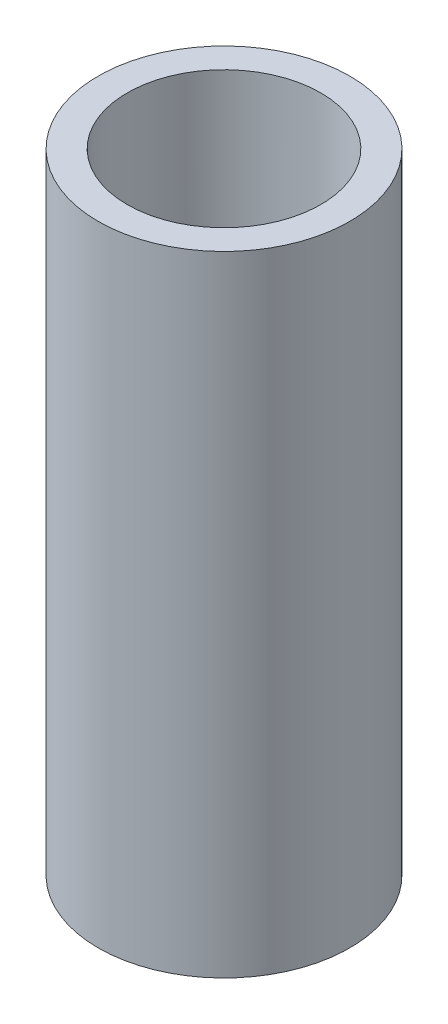
ISO-10303-21;
HEADER;
FILE_DESCRIPTION(('STEP AP214'),'2;1');
FILE_NAME('part.step','',(''),(''),'','','');
FILE_SCHEMA(('AUTOMOTIVE_DESIGN { 1 0 10303 214 1 1 1 1 }'));
ENDSEC;
DATA;
#1=APPLICATION_CONTEXT('core data for automotive mechanical design processes');
#2=APPLICATION_PROTOCOL_DEFINITION('international standard','automotive_design',2000,#1);
#3=PRODUCT_CONTEXT('',#1,'mechanical');
#4=PRODUCT('Part','Part','',(#3));
#5=PRODUCT_RELATED_PRODUCT_CATEGORY('part','',(#4));
#6=PRODUCT_DEFINITION_FORMATION('','',#4);
#7=PRODUCT_DEFINITION_CONTEXT('part definition',#1,'design');
#8=PRODUCT_DEFINITION('design','',#6,#7);
#9=PRODUCT_DEFINITION_SHAPE('','',#8);
#10=(LENGTH_UNIT() NAMED_UNIT(*) SI_UNIT(.MILLI.,.METRE.));
#11=(NAMED_UNIT(*) PLANE_ANGLE_UNIT() SI_UNIT($,.RADIAN.));
#12=(NAMED_UNIT(*) SI_UNIT($,.STERADIAN.) SOLID_ANGLE_UNIT());
#13=UNCERTAINTY_MEASURE_WITH_UNIT(LENGTH_MEASURE(1.E-05),#10,'distance_accuracy_value','');
#14=(GEOMETRIC_REPRESENTATION_CONTEXT(3) GLOBAL_UNCERTAINTY_ASSIGNED_CONTEXT((#13)) GLOBAL_UNIT_ASSIGNED_CONTEXT((#10,
#11,#12)) REPRESENTATION_CONTEXT('',''));
#15=CARTESIAN_POINT('',(0.,0.,0.));
#16=DIRECTION('',(0.,0.,1.));
#17=DIRECTION('',(1.,0.,0.));
#18=AXIS2_PLACEMENT_3D('',#15,#16,#17);
#19=CARTESIAN_POINT('',(0.,25.,0.));
#20=DIRECTION('',(0.,-1.,0.));
#21=DIRECTION('',(0.,0.,-1.));
#22=AXIS2_PLACEMENT_3D('',#19,#20,#21);
#23=PLANE('',#22);
#24=CARTESIAN_POINT('',(0.,25.,0.));
#25=DIRECTION('',(0.,-1.,0.));
#26=DIRECTION('',(0.,0.,-1.));
#27=AXIS2_PLACEMENT_3D('',#24,#25,#26);
#28=CIRCLE('',#27,11.);
#29=CARTESIAN_POINT('',(0.,25.,-11.));
#30=VERTEX_POINT('',#29);
#31=EDGE_CURVE('E100',#30,#30,#28,.T.);
#32=ORIENTED_EDGE('',*,*,#31,.T.);
#33=EDGE_LOOP('',(#32));
#34=FACE_BOUND('',#33,.T.);
#35=CARTESIAN_POINT('',(0.,25.,0.));
#36=DIRECTION('',(0.,-1.,0.));
#37=DIRECTION('',(0.,0.,-1.));
#38=AXIS2_PLACEMENT_3D('',#35,#36,#37);
#39=CIRCLE('',#38,2.85);
#40=CARTESIAN_POINT('',(-2.35,25.,-1.61245154965971));
#41=VERTEX_POINT('',#40);
#42=CARTESIAN_POINT('',(-2.35,25.,1.61245154965971));
#43=VERTEX_POINT('',#42);
#44=EDGE_CURVE('E71',#41,#43,#39,.T.);
#45=ORIENTED_EDGE('',*,*,#44,.F.);
#46=DIRECTION('',(0.,0.,-1.));
#47=VECTOR('',#46,1.);
#48=CARTESIAN_POINT('',(-2.35,25.,1.61245154965971));
#49=LINE('',#48,#47);
#50=EDGE_CURVE('E80',#43,#41,#49,.T.);
#51=ORIENTED_EDGE('',*,*,#50,.F.);
#52=EDGE_LOOP('',(#45,#51));
#53=FACE_BOUND('',#52,.T.);
#54=CARTESIAN_POINT('',(5.5,25.,0.));
#55=DIRECTION('',(0.,-1.,0.));
#56=DIRECTION('',(0.,0.,-1.));
#57=AXIS2_PLACEMENT_3D('',#54,#55,#56);
#58=CIRCLE('',#57,0.899999999999999);
#59=CARTESIAN_POINT('',(5.5,25.,-0.899999999999999));
#60=VERTEX_POINT('',#59);
#61=EDGE_CURVE('E88',#60,#60,#58,.T.);
#62=ORIENTED_EDGE('',*,*,#61,.F.);
#63=EDGE_LOOP('',(#62));
#64=FACE_BOUND('',#63,.T.);
#65=CARTESIAN_POINT('',(-5.5,25.,0.));
#66=DIRECTION('',(0.,-1.,0.));
#67=DIRECTION('',(0.,0.,1.));
#68=AXIS2_PLACEMENT_3D('',#65,#66,#67);
#69=CIRCLE('',#68,0.899999999999999);
#70=CARTESIAN_POINT('',(-5.5,25.,0.899999999999999));
#71=VERTEX_POINT('',#70);
#72=EDGE_CURVE('E112',#71,#71,#69,.T.);
#73=ORIENTED_EDGE('',*,*,#72,.F.);
#74=EDGE_LOOP('',(#73));
#75=FACE_BOUND('',#74,.T.);
#76=CARTESIAN_POINT('',(0.,25.,7.55));
#77=DIRECTION('',(0.,-1.,0.));
#78=DIRECTION('',(0.,0.,-1.));
#79=AXIS2_PLACEMENT_3D('',#76,#77,#78);
#80=CIRCLE('',#79,2.45);
#81=CARTESIAN_POINT('',(0.,25.,5.1));
#82=VERTEX_POINT('',#81);
#83=EDGE_CURVE('E114',#82,#82,#80,.T.);
#84=ORIENTED_EDGE('',*,*,#83,.F.);
#85=EDGE_LOOP('',(#84));
#86=FACE_BOUND('',#85,.T.);
#87=CARTESIAN_POINT('',(0.,25.,-7.55));
#88=DIRECTION('',(0.,1.,0.));
#89=DIRECTION('',(0.,0.,1.));
#90=AXIS2_PLACEMENT_3D('',#87,#88,#89);
#91=CIRCLE('',#90,2.45);
#92=CARTESIAN_POINT('',(0.,25.,-5.1));
#93=VERTEX_POINT('',#92);
#94=EDGE_CURVE('E111',#93,#93,#91,.T.);
#95=ORIENTED_EDGE('',*,*,#94,.T.);
#96=EDGE_LOOP('',(#95));
#97=FACE_BOUND('',#96,.T.);
#98=ADVANCED_FACE('F34',(#34,#53,#64,#75,#86,#97),#23,.T.);
#99=CARTESIAN_POINT('',(0.,30.,0.));
#100=DIRECTION('',(0.,1.,0.));
#101=DIRECTION('',(0.,0.,1.));
#102=AXIS2_PLACEMENT_3D('',#99,#100,#101);
#103=PLANE('',#102);
#104=CARTESIAN_POINT('',(0.,30.,0.));
#105=DIRECTION('',(0.,1.,0.));
#106=DIRECTION('',(0.,0.,1.));
#107=AXIS2_PLACEMENT_3D('',#104,#105,#106);
#108=CIRCLE('',#107,2.85);
#109=CARTESIAN_POINT('',(-2.35,30.,1.61245154965971));
#110=VERTEX_POINT('',#109);
#111=CARTESIAN_POINT('',(-2.35,30.,-1.61245154965971));
#112=VERTEX_POINT('',#111);
#113=EDGE_CURVE('E11',#110,#112,#108,.T.);
#114=ORIENTED_EDGE('',*,*,#113,.F.);
#115=DIRECTION('',(0.,0.,1.));
#116=VECTOR('',#115,1.);
#117=CARTESIAN_POINT('',(-2.35,30.,0.));
#118=LINE('',#117,#116);
#119=EDGE_CURVE('E43',#112,#110,#118,.T.);
#120=ORIENTED_EDGE('',*,*,#119,.F.);
#121=EDGE_LOOP('',(#114,#120));
#122=FACE_BOUND('',#121,.T.);
#123=CARTESIAN_POINT('',(0.,30.,0.));
#124=DIRECTION('',(0.,1.,0.));
#125=DIRECTION('',(0.,0.,1.));
#126=AXIS2_PLACEMENT_3D('',#123,#124,#125);
#127=CIRCLE('',#126,10.);
#128=CARTESIAN_POINT('',(0.,30.,10.));
#129=VERTEX_POINT('',#128);
#130=CARTESIAN_POINT('',(0.,30.,-10.));
#131=VERTEX_POINT('',#130);
#132=EDGE_CURVE('E93',#129,#131,#127,.T.);
#133=ORIENTED_EDGE('',*,*,#132,.T.);
#134=CARTESIAN_POINT('',(0.,30.,-7.55));
#135=DIRECTION('',(0.,1.,0.));
#136=DIRECTION('',(0.,0.,1.));
#137=AXIS2_PLACEMENT_3D('',#134,#135,#136);
#138=CIRCLE('',#137,2.45);
#139=EDGE_CURVE('E38',#131,#131,#138,.F.);
#140=ORIENTED_EDGE('',*,*,#139,.T.);
#141=EDGE_CURVE('E97',#131,#129,#127,.T.);
#142=ORIENTED_EDGE('',*,*,#141,.T.);
#143=CARTESIAN_POINT('',(0.,30.,7.55));
#144=DIRECTION('',(0.,1.,0.));
#145=DIRECTION('',(0.,0.,1.));
#146=AXIS2_PLACEMENT_3D('',#143,#144,#145);
#147=CIRCLE('',#146,2.45);
#148=EDGE_CURVE('E53',#129,#129,#147,.T.);
#149=ORIENTED_EDGE('',*,*,#148,.F.);
#150=EDGE_LOOP('',(#133,#140,#142,#149));
#151=FACE_BOUND('',#150,.T.);
#152=ADVANCED_FACE('F131',(#122,#151),#103,.T.);
#153=CARTESIAN_POINT('',(0.,65.,0.));
#154=DIRECTION('',(0.,-1.,0.));
#155=DIRECTION('',(0.,0.,-1.));
#156=AXIS2_PLACEMENT_3D('',#153,#154,#155);
#157=CYLINDRICAL_SURFACE('',#156,13.);
#158=CARTESIAN_POINT('',(0.,65.,0.));
#159=DIRECTION('',(0.,1.,0.));
#160=DIRECTION('',(0.,0.,1.));
#161=AXIS2_PLACEMENT_3D('',#158,#159,#160);
#162=CIRCLE('',#161,13.);
#163=CARTESIAN_POINT('',(0.,65.,13.));
#164=VERTEX_POINT('',#163);
#165=EDGE_CURVE('E106',#164,#164,#162,.T.);
#166=ORIENTED_EDGE('',*,*,#165,.F.);
#167=EDGE_LOOP('',(#166));
#168=FACE_BOUND('',#167,.T.);
#169=CARTESIAN_POINT('',(0.,0.,0.));
#170=DIRECTION('',(0.,1.,0.));
#171=DIRECTION('',(0.,0.,1.));
#172=AXIS2_PLACEMENT_3D('',#169,#170,#171);
#173=CIRCLE('',#172,13.);
#174=CARTESIAN_POINT('',(0.,0.,13.));
#175=VERTEX_POINT('',#174);
#176=EDGE_CURVE('E103',#175,#175,#173,.T.);
#177=ORIENTED_EDGE('',*,*,#176,.T.);
#178=EDGE_LOOP('',(#177));
#179=FACE_BOUND('',#178,.T.);
#180=ADVANCED_FACE('F36',(#168,#179),#157,.T.);
#181=CARTESIAN_POINT('',(0.,65.,0.));
#182=DIRECTION('',(0.,1.,0.));
#183=DIRECTION('',(0.,0.,1.));
#184=AXIS2_PLACEMENT_3D('',#181,#182,#183);
#185=PLANE('',#184);
#186=CARTESIAN_POINT('',(0.,65.,0.));
#187=DIRECTION('',(0.,1.,0.));
#188=DIRECTION('',(0.,0.,1.));
#189=AXIS2_PLACEMENT_3D('',#186,#187,#188);
#190=CIRCLE('',#189,10.);
#191=CARTESIAN_POINT('',(0.,65.,10.));
#192=VERTEX_POINT('',#191);
#193=EDGE_CURVE('E76',#192,#192,#190,.T.);
#194=ORIENTED_EDGE('',*,*,#193,.F.);
#195=EDGE_LOOP('',(#194));
#196=FACE_BOUND('',#195,.T.);
#197=ORIENTED_EDGE('',*,*,#165,.T.);
#198=EDGE_LOOP('',(#197));
#199=FACE_BOUND('',#198,.T.);
#200=ADVANCED_FACE('F176',(#196,#199),#185,.T.);
#201=CARTESIAN_POINT('',(0.,0.,0.));
#202=DIRECTION('',(0.,1.,0.));
#203=DIRECTION('',(0.,0.,1.));
#204=AXIS2_PLACEMENT_3D('',#201,#202,#203);
#205=PLANE('',#204);
#206=CARTESIAN_POINT('',(0.,0.,0.));
#207=DIRECTION('',(0.,-1.,0.));
#208=DIRECTION('',(0.,0.,-1.));
#209=AXIS2_PLACEMENT_3D('',#206,#207,#208);
#210=CIRCLE('',#209,11.);
#211=CARTESIAN_POINT('',(0.,0.,-11.));
#212=VERTEX_POINT('',#211);
#213=EDGE_CURVE('E96',#212,#212,#210,.T.);
#214=ORIENTED_EDGE('',*,*,#213,.F.);
#215=EDGE_LOOP('',(#214));
#216=FACE_BOUND('',#215,.T.);
#217=ORIENTED_EDGE('',*,*,#176,.F.);
#218=EDGE_LOOP('',(#217));
#219=FACE_BOUND('',#218,.T.);
#220=ADVANCED_FACE('F174',(#216,#219),#205,.F.);
#221=CARTESIAN_POINT('',(0.,25.,0.));
#222=DIRECTION('',(0.,-1.,0.));
#223=DIRECTION('',(0.,0.,-1.));
#224=AXIS2_PLACEMENT_3D('',#221,#222,#223);
#225=CYLINDRICAL_SURFACE('',#224,11.);
#226=ORIENTED_EDGE('',*,*,#31,.F.);
#227=EDGE_LOOP('',(#226));
#228=FACE_BOUND('',#227,.T.);
#229=ORIENTED_EDGE('',*,*,#213,.T.);
#230=EDGE_LOOP('',(#229));
#231=FACE_BOUND('',#230,.T.);
#232=ADVANCED_FACE('F169',(#228,#231),#225,.F.);
#233=CARTESIAN_POINT('',(0.,30.,0.));
#234=DIRECTION('',(0.,1.,0.));
#235=DIRECTION('',(0.,0.,1.));
#236=AXIS2_PLACEMENT_3D('',#233,#234,#235);
#237=CYLINDRICAL_SURFACE('',#236,10.);
#238=ORIENTED_EDGE('',*,*,#141,.F.);
#239=ORIENTED_EDGE('',*,*,#132,.F.);
#240=EDGE_LOOP('',(#238,#239));
#241=FACE_BOUND('',#240,.T.);
#242=ORIENTED_EDGE('',*,*,#193,.T.);
#243=EDGE_LOOP('',(#242));
#244=FACE_BOUND('',#243,.T.);
#245=ADVANCED_FACE('F164',(#241,#244),#237,.F.);
#246=CARTESIAN_POINT('',(0.,65.,0.));
#247=DIRECTION('',(0.,-1.,0.));
#248=DIRECTION('',(0.,0.,-1.));
#249=AXIS2_PLACEMENT_3D('',#246,#247,#248);
#250=CYLINDRICAL_SURFACE('',#249,2.85);
#251=ORIENTED_EDGE('',*,*,#113,.T.);
#252=DIRECTION('',(0.,-1.,0.));
#253=VECTOR('',#252,1.);
#254=CARTESIAN_POINT('',(-2.35,65.,-1.61245154965971));
#255=LINE('',#254,#253);
#256=EDGE_CURVE('E66',#112,#41,#255,.T.);
#257=ORIENTED_EDGE('',*,*,#256,.T.);
#258=ORIENTED_EDGE('',*,*,#44,.T.);
#259=DIRECTION('',(0.,-1.,0.));
#260=VECTOR('',#259,1.);
#261=CARTESIAN_POINT('',(-2.35,65.,1.61245154965971));
#262=LINE('',#261,#260);
#263=EDGE_CURVE('E77',#110,#43,#262,.T.);
#264=ORIENTED_EDGE('',*,*,#263,.F.);
#265=EDGE_LOOP('',(#251,#257,#258,#264));
#266=FACE_BOUND('',#265,.T.);
#267=ADVANCED_FACE('F68',(#266),#250,.F.);
#268=CARTESIAN_POINT('',(-2.35,65.,1.61245154965971));
#269=DIRECTION('',(-1.,0.,0.));
#270=DIRECTION('',(0.,0.,1.));
#271=AXIS2_PLACEMENT_3D('',#268,#269,#270);
#272=PLANE('',#271);
#273=ORIENTED_EDGE('',*,*,#119,.T.);
#274=ORIENTED_EDGE('',*,*,#263,.T.);
#275=ORIENTED_EDGE('',*,*,#50,.T.);
#276=ORIENTED_EDGE('',*,*,#256,.F.);
#277=EDGE_LOOP('',(#273,#274,#275,#276));
#278=FACE_BOUND('',#277,.T.);
#279=ADVANCED_FACE('F81',(#278),#272,.F.);
#280=CARTESIAN_POINT('',(5.5,23.,0.));
#281=DIRECTION('',(0.,1.,0.));
#282=DIRECTION('',(0.,0.,1.));
#283=AXIS2_PLACEMENT_3D('',#280,#281,#282);
#284=CYLINDRICAL_SURFACE('',#283,0.899999999999999);
#285=CARTESIAN_POINT('',(5.5,23.,0.));
#286=DIRECTION('',(0.,-1.,0.));
#287=DIRECTION('',(0.,0.,-1.));
#288=AXIS2_PLACEMENT_3D('',#285,#286,#287);
#289=CIRCLE('',#288,0.899999999999999);
#290=CARTESIAN_POINT('',(5.5,23.,-0.899999999999999));
#291=VERTEX_POINT('',#290);
#292=EDGE_CURVE('E85',#291,#291,#289,.T.);
#293=ORIENTED_EDGE('',*,*,#292,.F.);
#294=EDGE_LOOP('',(#293));
#295=FACE_BOUND('',#294,.T.);
#296=ORIENTED_EDGE('',*,*,#61,.T.);
#297=EDGE_LOOP('',(#296));
#298=FACE_BOUND('',#297,.T.);
#299=ADVANCED_FACE('F155',(#295,#298),#284,.T.);
#300=CARTESIAN_POINT('',(5.5,23.,0.));
#301=DIRECTION('',(0.,-1.,0.));
#302=DIRECTION('',(0.,0.,-1.));
#303=AXIS2_PLACEMENT_3D('',#300,#301,#302);
#304=PLANE('',#303);
#305=ORIENTED_EDGE('',*,*,#292,.T.);
#306=EDGE_LOOP('',(#305));
#307=FACE_BOUND('',#306,.T.);
#308=ADVANCED_FACE('F151',(#307),#304,.T.);
#309=CARTESIAN_POINT('',(-5.5,23.,0.));
#310=DIRECTION('',(0.,1.,0.));
#311=DIRECTION('',(0.,0.,1.));
#312=AXIS2_PLACEMENT_3D('',#309,#310,#311);
#313=CYLINDRICAL_SURFACE('',#312,0.899999999999999);
#314=CARTESIAN_POINT('',(-5.5,23.,0.));
#315=DIRECTION('',(0.,-1.,0.));
#316=DIRECTION('',(0.,0.,1.));
#317=AXIS2_PLACEMENT_3D('',#314,#315,#316);
#318=CIRCLE('',#317,0.899999999999999);
#319=CARTESIAN_POINT('',(-5.5,23.,0.899999999999999));
#320=VERTEX_POINT('',#319);
#321=EDGE_CURVE('E121',#320,#320,#318,.T.);
#322=ORIENTED_EDGE('',*,*,#321,.F.);
#323=EDGE_LOOP('',(#322));
#324=FACE_BOUND('',#323,.T.);
#325=ORIENTED_EDGE('',*,*,#72,.T.);
#326=EDGE_LOOP('',(#325));
#327=FACE_BOUND('',#326,.T.);
#328=ADVANCED_FACE('F127',(#324,#327),#313,.T.);
#329=CARTESIAN_POINT('',(-5.5,23.,0.));
#330=DIRECTION('',(0.,1.,0.));
#331=DIRECTION('',(0.,0.,1.));
#332=AXIS2_PLACEMENT_3D('',#329,#330,#331);
#333=PLANE('',#332);
#334=ORIENTED_EDGE('',*,*,#321,.T.);
#335=EDGE_LOOP('',(#334));
#336=FACE_BOUND('',#335,.T.);
#337=ADVANCED_FACE('F139',(#336),#333,.F.);
#338=CARTESIAN_POINT('',(0.,65.,7.55));
#339=DIRECTION('',(0.,-1.,0.));
#340=DIRECTION('',(0.,0.,-1.));
#341=AXIS2_PLACEMENT_3D('',#338,#339,#340);
#342=CYLINDRICAL_SURFACE('',#341,2.45);
#343=ORIENTED_EDGE('',*,*,#148,.T.);
#344=EDGE_LOOP('',(#343));
#345=FACE_BOUND('',#344,.T.);
#346=ORIENTED_EDGE('',*,*,#83,.T.);
#347=EDGE_LOOP('',(#346));
#348=FACE_BOUND('',#347,.T.);
#349=ADVANCED_FACE('F136',(#345,#348),#342,.F.);
#350=CARTESIAN_POINT('',(0.,65.,-7.55));
#351=DIRECTION('',(0.,-1.,0.));
#352=DIRECTION('',(0.,0.,-1.));
#353=AXIS2_PLACEMENT_3D('',#350,#351,#352);
#354=CYLINDRICAL_SURFACE('',#353,2.45);
#355=ORIENTED_EDGE('',*,*,#139,.F.);
#356=EDGE_LOOP('',(#355));
#357=FACE_BOUND('',#356,.T.);
#358=ORIENTED_EDGE('',*,*,#94,.F.);
#359=EDGE_LOOP('',(#358));
#360=FACE_BOUND('',#359,.T.);
#361=ADVANCED_FACE('F138',(#357,#360),#354,.F.);
#362=CLOSED_SHELL('',(#98,#152,#180,#200,#220,#232,#245,#267,#279,#299,#308,#328,#337,#349,#361));
#363=MANIFOLD_SOLID_BREP('B2',#362);
#364=ADVANCED_BREP_SHAPE_REPRESENTATION('',(#18,#363),#14);
#365=SHAPE_DEFINITION_REPRESENTATION(#9,#364);
ENDSEC;
END-ISO-10303-21;
